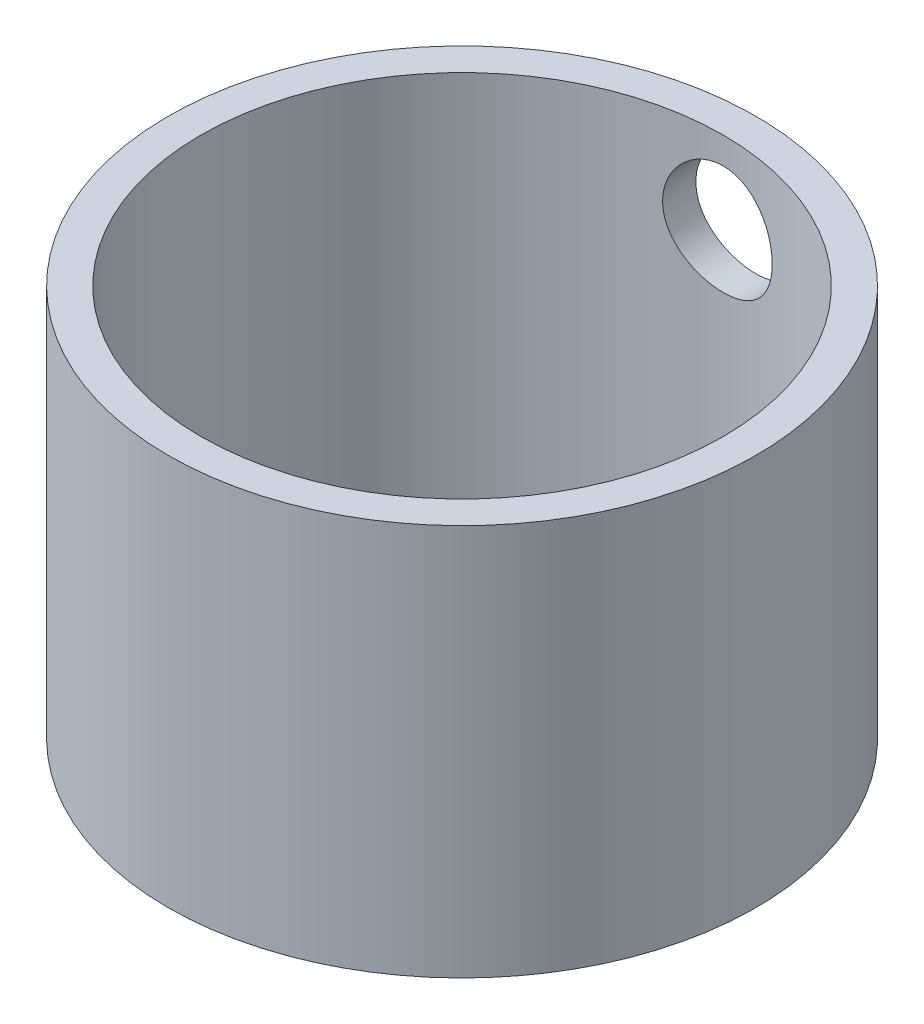
ISO-10303-21;
HEADER;
FILE_DESCRIPTION(('STEP AP214'),'2;1');
FILE_NAME('part.step','',(''),(''),'','','');
FILE_SCHEMA(('AUTOMOTIVE_DESIGN { 1 0 10303 214 1 1 1 1 }'));
ENDSEC;
DATA;
#1=APPLICATION_CONTEXT('core data for automotive mechanical design processes');
#2=APPLICATION_PROTOCOL_DEFINITION('international standard','automotive_design',2000,#1);
#3=PRODUCT_CONTEXT('',#1,'mechanical');
#4=PRODUCT('Part','Part','',(#3));
#5=PRODUCT_RELATED_PRODUCT_CATEGORY('part','',(#4));
#6=PRODUCT_DEFINITION_FORMATION('','',#4);
#7=PRODUCT_DEFINITION_CONTEXT('part definition',#1,'design');
#8=PRODUCT_DEFINITION('design','',#6,#7);
#9=PRODUCT_DEFINITION_SHAPE('','',#8);
#10=(LENGTH_UNIT() NAMED_UNIT(*) SI_UNIT(.MILLI.,.METRE.));
#11=(NAMED_UNIT(*) PLANE_ANGLE_UNIT() SI_UNIT($,.RADIAN.));
#12=(NAMED_UNIT(*) SI_UNIT($,.STERADIAN.) SOLID_ANGLE_UNIT());
#13=UNCERTAINTY_MEASURE_WITH_UNIT(LENGTH_MEASURE(1.E-05),#10,'distance_accuracy_value','');
#14=(GEOMETRIC_REPRESENTATION_CONTEXT(3) GLOBAL_UNCERTAINTY_ASSIGNED_CONTEXT((#13)) GLOBAL_UNIT_ASSIGNED_CONTEXT((#10,
#11,#12)) REPRESENTATION_CONTEXT('',''));
#15=CARTESIAN_POINT('',(0.,0.,0.));
#16=DIRECTION('',(0.,0.,1.));
#17=DIRECTION('',(1.,0.,0.));
#18=AXIS2_PLACEMENT_3D('',#15,#16,#17);
#19=CARTESIAN_POINT('',(0.,76.2,0.));
#20=DIRECTION('',(0.,1.,0.));
#21=DIRECTION('',(0.,0.,1.));
#22=AXIS2_PLACEMENT_3D('',#19,#20,#21);
#23=PLANE('',#22);
#24=CARTESIAN_POINT('',(0.,76.2,0.));
#25=DIRECTION('',(0.,1.,0.));
#26=DIRECTION('',(0.,0.,1.));
#27=AXIS2_PLACEMENT_3D('',#24,#25,#26);
#28=CIRCLE('',#27,57.15);
#29=CARTESIAN_POINT('',(0.,76.2,57.15));
#30=VERTEX_POINT('',#29);
#31=EDGE_CURVE('E10',#30,#30,#28,.T.);
#32=ORIENTED_EDGE('',*,*,#31,.T.);
#33=EDGE_LOOP('',(#32));
#34=FACE_BOUND('',#33,.T.);
#35=CARTESIAN_POINT('',(0.,76.2,0.));
#36=DIRECTION('',(0.,1.,0.));
#37=DIRECTION('',(0.,0.,1.));
#38=AXIS2_PLACEMENT_3D('',#35,#36,#37);
#39=CIRCLE('',#38,50.8);
#40=CARTESIAN_POINT('',(0.,76.2,50.8));
#41=VERTEX_POINT('',#40);
#42=EDGE_CURVE('E48',#41,#41,#39,.T.);
#43=ORIENTED_EDGE('',*,*,#42,.F.);
#44=EDGE_LOOP('',(#43));
#45=FACE_BOUND('',#44,.T.);
#46=ADVANCED_FACE('F37',(#34,#45),#23,.T.);
#47=CARTESIAN_POINT('',(0.,0.,0.));
#48=DIRECTION('',(0.,1.,0.));
#49=DIRECTION('',(0.,0.,1.));
#50=AXIS2_PLACEMENT_3D('',#47,#48,#49);
#51=PLANE('',#50);
#52=CARTESIAN_POINT('',(0.,0.,0.));
#53=DIRECTION('',(0.,1.,0.));
#54=DIRECTION('',(0.,0.,1.));
#55=AXIS2_PLACEMENT_3D('',#52,#53,#54);
#56=CIRCLE('',#55,57.15);
#57=CARTESIAN_POINT('',(0.,0.,57.15));
#58=VERTEX_POINT('',#57);
#59=EDGE_CURVE('E41',#58,#58,#56,.T.);
#60=ORIENTED_EDGE('',*,*,#59,.F.);
#61=EDGE_LOOP('',(#60));
#62=FACE_BOUND('',#61,.T.);
#63=CARTESIAN_POINT('',(0.,0.,0.));
#64=DIRECTION('',(0.,1.,0.));
#65=DIRECTION('',(0.,0.,1.));
#66=AXIS2_PLACEMENT_3D('',#63,#64,#65);
#67=CIRCLE('',#66,50.8);
#68=CARTESIAN_POINT('',(0.,0.,50.8));
#69=VERTEX_POINT('',#68);
#70=EDGE_CURVE('E50',#69,#69,#67,.T.);
#71=ORIENTED_EDGE('',*,*,#70,.T.);
#72=EDGE_LOOP('',(#71));
#73=FACE_BOUND('',#72,.T.);
#74=ADVANCED_FACE('F81',(#62,#73),#51,.F.);
#75=CARTESIAN_POINT('',(0.,76.2,0.));
#76=DIRECTION('',(0.,-1.,0.));
#77=DIRECTION('',(0.,0.,-1.));
#78=AXIS2_PLACEMENT_3D('',#75,#76,#77);
#79=CYLINDRICAL_SURFACE('',#78,57.15);
#80=CARTESIAN_POINT('',(10.668,60.325,-56.1454920363158));
#81=CARTESIAN_POINT('',(10.6680053435055,60.0281002142376,-56.1454893128091));
#82=CARTESIAN_POINT('',(10.6556020219108,59.7312693918652,-56.1478515293687));
#83=CARTESIAN_POINT('',(10.606095905013,59.1396585889627,-56.1572249422256));
#84=CARTESIAN_POINT('',(10.5689886300752,58.8448789901844,-56.164236981687));
#85=CARTESIAN_POINT('',(10.4703208308121,58.2593695400203,-56.1827142781587));
#86=CARTESIAN_POINT('',(10.4087422146498,57.9686428499494,-56.1941828297608));
#87=CARTESIAN_POINT('',(10.2616122363095,57.3935085448499,-56.2212362500718));
#88=CARTESIAN_POINT('',(10.1760602951187,57.1091010826249,-56.2368212182015));
#89=CARTESIAN_POINT('',(9.98173011068625,56.5488761749935,-56.2716384014403));
#90=CARTESIAN_POINT('',(9.87297423932011,56.273050746732,-56.2908671014924));
#91=CARTESIAN_POINT('',(9.63299352385481,55.73159688208,-56.3324307618894));
#92=CARTESIAN_POINT('',(9.5017684559971,55.4659685472691,-56.3547657531676));
#93=CARTESIAN_POINT('',(9.21781176024307,54.9467362763359,-56.4019072936164));
#94=CARTESIAN_POINT('',(9.06508238378619,54.6931310851357,-56.4267135839697));
#95=CARTESIAN_POINT('',(8.73917781947796,54.199606707423,-56.4781061476302));
#96=CARTESIAN_POINT('',(8.56600236846665,53.9596876971232,-56.5046924438458));
#97=CARTESIAN_POINT('',(8.19837053410756,53.4925584092556,-56.5592089796012));
#98=CARTESIAN_POINT('',(8.00370003086592,53.2655179721948,-56.5871508282602));
#99=CARTESIAN_POINT('',(7.59601086580315,52.8285926375836,-56.6433177742366));
#100=CARTESIAN_POINT('',(7.38299206630169,52.6187078687876,-56.6715428736781));
#101=CARTESIAN_POINT('',(6.94003755155489,52.2175095803362,-56.7274907321899));
#102=CARTESIAN_POINT('',(6.7101005311614,52.0261974961079,-56.7552134522984));
#103=CARTESIAN_POINT('',(6.23488729965975,51.6634904177321,-56.8093817790818));
#104=CARTESIAN_POINT('',(5.98961146574776,51.4920949341121,-56.8358274171331));
#105=CARTESIAN_POINT('',(5.4834662250539,51.1692033504364,-56.8868989474121));
#106=CARTESIAN_POINT('',(5.22249266591591,51.0178680221405,-56.9115095179408));
#107=CARTESIAN_POINT('',(4.68847203991897,50.7377498868863,-56.957989377066));
#108=CARTESIAN_POINT('',(4.41542489313855,50.6089672292442,-56.9798586475127));
#109=CARTESIAN_POINT('',(3.85920238113102,50.374934035286,-57.0202314557637));
#110=CARTESIAN_POINT('',(3.57602765563367,50.2696820156424,-57.0387352057104));
#111=CARTESIAN_POINT('',(3.00156615102237,50.0835163714256,-57.0718482636382));
#112=CARTESIAN_POINT('',(2.71027947477779,50.0026024383694,-57.0864576209801));
#113=CARTESIAN_POINT('',(2.12510665673257,49.8665422124005,-57.1112177166413));
#114=CARTESIAN_POINT('',(1.83128911202005,49.8111098285821,-57.1214178769915));
#115=CARTESIAN_POINT('',(1.23991841352963,49.7250894634677,-57.1373134494815));
#116=CARTESIAN_POINT('',(0.94236528558942,49.6945013104289,-57.1430088927613));
#117=CARTESIAN_POINT('',(0.345710954915687,49.6584154245063,-57.1497330447847));
#118=CARTESIAN_POINT('',(0.0466098685799811,49.6529158317761,-57.1507620994534));
#119=CARTESIAN_POINT('',(-0.550976149248027,49.6670464126327,-57.1481250983446));
#120=CARTESIAN_POINT('',(-0.849461084890794,49.6866764163866,-57.1444590742979));
#121=CARTESIAN_POINT('',(-1.43994039745177,49.7505078680778,-57.1326106040949));
#122=CARTESIAN_POINT('',(-1.73196933132848,49.7944007711553,-57.1244848798254));
#123=CARTESIAN_POINT('',(-2.31123832041491,49.9061990492478,-57.1039812391106));
#124=CARTESIAN_POINT('',(-2.5984784218681,49.9741041922474,-57.0916033637512));
#125=CARTESIAN_POINT('',(-3.16617206399007,50.1334105448513,-57.0629357699026));
#126=CARTESIAN_POINT('',(-3.44662544224986,50.2248123161322,-57.0466459579009));
#127=CARTESIAN_POINT('',(-3.99881031490527,50.4304288109504,-57.0106005737705));
#128=CARTESIAN_POINT('',(-4.27054173456425,50.5446437299083,-56.9908449719536));
#129=CARTESIAN_POINT('',(-4.8049291915128,50.7957543534805,-56.9482871547747));
#130=CARTESIAN_POINT('',(-5.06752605662121,50.9327731858043,-56.9254685379024));
#131=CARTESIAN_POINT('',(-5.58026384966287,51.2280552234607,-56.8774952640658));
#132=CARTESIAN_POINT('',(-5.83040475000099,51.3863184758556,-56.8523406019266));
#133=CARTESIAN_POINT('',(-6.31658031631716,51.7229959674325,-56.8003793562522));
#134=CARTESIAN_POINT('',(-6.55261393721327,51.9014116967086,-56.7735726506298));
#135=CARTESIAN_POINT('',(-7.00899689455062,52.2771704029406,-56.7190381734023));
#136=CARTESIAN_POINT('',(-7.22934572471225,52.4745139903749,-56.691310372108));
#137=CARTESIAN_POINT('',(-7.65611372145628,52.889936847343,-56.6352668634976));
#138=CARTESIAN_POINT('',(-7.86227017639148,53.1082857559613,-56.6069486271238));
#139=CARTESIAN_POINT('',(-8.25548697805042,53.5616283962884,-56.5509406440695));
#140=CARTESIAN_POINT('',(-8.44254712130291,53.7966223053044,-56.5232509040881));
#141=CARTESIAN_POINT('',(-8.79626888407681,54.2816586900094,-56.469285234151));
#142=CARTESIAN_POINT('',(-8.96292982115609,54.5317016687379,-56.4430093515116));
#143=CARTESIAN_POINT('',(-9.27465069238803,55.0451075981382,-56.3926262297478));
#144=CARTESIAN_POINT('',(-9.41971129743046,55.3084701347742,-56.3685189232784));
#145=CARTESIAN_POINT('',(-9.68740276471404,55.8471584551608,-56.323132019947));
#146=CARTESIAN_POINT('',(-9.80999500364834,56.1225038508072,-56.3018573091935));
#147=CARTESIAN_POINT('',(-10.0315173846072,56.6827984401222,-56.2628102652673));
#148=CARTESIAN_POINT('',(-10.1304474591817,56.9677476611643,-56.2450379420783));
#149=CARTESIAN_POINT('',(-10.3038678152634,57.5451801325214,-56.2135266906923));
#150=CARTESIAN_POINT('',(-10.3783603428246,57.8376626877817,-56.1997873918322));
#151=CARTESIAN_POINT('',(-10.5023235857421,58.4280546256904,-56.1767539265343));
#152=CARTESIAN_POINT('',(-10.5517946481744,58.7259639330043,-56.1674596984384));
#153=CARTESIAN_POINT('',(-10.6247650455299,59.3205315410175,-56.1537017977373));
#154=CARTESIAN_POINT('',(-10.6486415425639,59.6171419790165,-56.1491679964493));
#155=CARTESIAN_POINT('',(-10.6715373301968,60.2113540139756,-56.1448210360734));
#156=CARTESIAN_POINT('',(-10.6705568670674,60.5089556010866,-56.1450078302158));
#157=CARTESIAN_POINT('',(-10.6437475281067,61.1029821047678,-56.1500963736186));
#158=CARTESIAN_POINT('',(-10.6179197984644,61.3994070749814,-56.154997905391));
#159=CARTESIAN_POINT('',(-10.5416233775702,61.9889553154861,-56.1693704773642));
#160=CARTESIAN_POINT('',(-10.4911547289198,62.2820785914846,-56.1788415096648));
#161=CARTESIAN_POINT('',(-10.3664878605068,62.8605428593687,-56.2019786778698));
#162=CARTESIAN_POINT('',(-10.2924875761907,63.1459279514618,-56.2156097842757));
#163=CARTESIAN_POINT('',(-10.1212026124785,63.7094043427048,-56.246700581834));
#164=CARTESIAN_POINT('',(-10.0239180996944,63.9874956940298,-56.2641602455908));
#165=CARTESIAN_POINT('',(-9.80678092253286,64.5344972106103,-56.3024128422035));
#166=CARTESIAN_POINT('',(-9.68692728128441,64.8034069778592,-56.3232059193355));
#167=CARTESIAN_POINT('',(-9.42551533077492,65.3302333253695,-56.3675414267328));
#168=CARTESIAN_POINT('',(-9.28395621660532,65.5881494974998,-56.3910839589491));
#169=CARTESIAN_POINT('',(-8.97839124442529,66.094147293291,-56.4405457734426));
#170=CARTESIAN_POINT('',(-8.8141472786049,66.3420827835569,-56.4664891496591));
#171=CARTESIAN_POINT('',(-8.46562351787587,66.8232844592019,-56.5197910848102));
#172=CARTESIAN_POINT('',(-8.28134359257236,67.0565505490964,-56.5471496529543));
#173=CARTESIAN_POINT('',(-7.89399291297515,67.5068740808414,-56.6025232987714));
#174=CARTESIAN_POINT('',(-7.69092046597822,67.7239300594067,-56.6305384354137));
#175=CARTESIAN_POINT('',(-7.26737391436169,68.1403502466439,-56.6864480636977));
#176=CARTESIAN_POINT('',(-7.04690009962031,68.3397147499093,-56.7143425573411));
#177=CARTESIAN_POINT('',(-6.58698853513211,68.7219272201504,-56.7696082446884));
#178=CARTESIAN_POINT('',(-6.34733798004234,68.9045209429374,-56.7969675843192));
#179=CARTESIAN_POINT('',(-5.85332583451095,69.2488701137769,-56.8500024698119));
#180=CARTESIAN_POINT('',(-5.59896409645104,69.4106253526746,-56.8756779987722));
#181=CARTESIAN_POINT('',(-5.07729650085051,69.7121209417771,-56.9246183969944));
#182=CARTESIAN_POINT('',(-4.80999097206084,69.8518618507265,-56.9478833274346));
#183=CARTESIAN_POINT('',(-4.26430253630616,70.1082933357046,-56.9913425665682));
#184=CARTESIAN_POINT('',(-3.98591972854895,70.2249841181139,-57.011536902754));
#185=CARTESIAN_POINT('',(-3.42153063954877,70.43387835645,-57.0481828992564));
#186=CARTESIAN_POINT('',(-3.13557170777546,70.5262063890717,-57.0646535358305));
#187=CARTESIAN_POINT('',(-2.55669111083468,70.6864549173808,-57.0935180683261));
#188=CARTESIAN_POINT('',(-2.26376945946885,70.754375461445,-57.1059119723278));
#189=CARTESIAN_POINT('',(-1.67311412298725,70.8652655383268,-57.1262680282703));
#190=CARTESIAN_POINT('',(-1.37538086032568,70.9082372495228,-57.1342305671282));
#191=CARTESIAN_POINT('',(-0.777262955517664,70.9688921042587,-57.1454969640587));
#192=CARTESIAN_POINT('',(-0.476878343879288,70.9865755384004,-57.1488008756662));
#193=CARTESIAN_POINT('',(0.119756129154167,70.9964359808056,-57.1506413117886));
#194=CARTESIAN_POINT('',(0.41599950580166,70.9889962615494,-57.1492494737742));
#195=CARTESIAN_POINT('',(1.0067821900631,70.9495120996756,-57.1418949436562));
#196=CARTESIAN_POINT('',(1.30132151609208,70.9174679234516,-57.1359323010409));
#197=CARTESIAN_POINT('',(1.88659106569367,70.8290272681934,-57.1196024155989));
#198=CARTESIAN_POINT('',(2.17732134283925,70.772631132041,-57.1092352347892));
#199=CARTESIAN_POINT('',(2.75292297534597,70.6359234169398,-57.0843840745364));
#200=CARTESIAN_POINT('',(3.03779430994561,70.5556117532605,-57.0699000805078));
#201=CARTESIAN_POINT('',(3.59919612374446,70.3718450460076,-57.0372441226281));
#202=CARTESIAN_POINT('',(3.87574035327473,70.2684308330535,-57.0190786704483));
#203=CARTESIAN_POINT('',(4.41911501173276,70.0391445635615,-56.9795413846814));
#204=CARTESIAN_POINT('',(4.68594546786122,69.9132725699163,-56.9581695600737));
#205=CARTESIAN_POINT('',(5.20805056334296,69.6400006529202,-56.9128049797255));
#206=CARTESIAN_POINT('',(5.46332717504993,69.4926044222619,-56.8888126737318));
#207=CARTESIAN_POINT('',(5.96078813016199,69.177231468022,-56.8388426679564));
#208=CARTESIAN_POINT('',(6.20296651763529,69.0092454935468,-56.8128640777313));
#209=CARTESIAN_POINT('',(6.6758468736523,68.6513711633385,-56.7592547592977));
#210=CARTESIAN_POINT('',(6.90633717839445,68.461205791762,-56.73160581574));
#211=CARTESIAN_POINT('',(7.35043244233507,68.0623387397904,-56.6757771889852));
#212=CARTESIAN_POINT('',(7.56404434257864,67.8536447548425,-56.6475977299221));
#213=CARTESIAN_POINT('',(7.97313432236454,67.4189738598418,-56.5914683169194));
#214=CARTESIAN_POINT('',(8.168604232459,67.1929892464768,-56.5635184714901));
#215=CARTESIAN_POINT('',(8.53995872375113,66.7253497580238,-56.50864399098));
#216=CARTESIAN_POINT('',(8.7158434691695,66.4836950143559,-56.4817193473041));
#217=CARTESIAN_POINT('',(9.04832424384853,65.9840564183997,-56.4294153918447));
#218=CARTESIAN_POINT('',(9.20472799464828,65.7259428260576,-56.4040525701628));
#219=CARTESIAN_POINT('',(9.49519485663734,65.1972154690247,-56.3558821822724));
#220=CARTESIAN_POINT('',(9.62925833408055,64.9266019093556,-56.3330745741751));
#221=CARTESIAN_POINT('',(9.87394395637644,64.3749873384021,-56.2907022244708));
#222=CARTESIAN_POINT('',(9.98458535612375,64.0939950842375,-56.2711348220505));
#223=CARTESIAN_POINT('',(10.1816889037324,63.5235208620071,-56.2358044417008));
#224=CARTESIAN_POINT('',(10.2681559503713,63.2340406271319,-56.2200406930743));
#225=CARTESIAN_POINT('',(10.4501537600048,62.514539708433,-56.1865560143568));
#226=CARTESIAN_POINT('',(10.5317404811743,62.080798657161,-56.1712378077497));
#227=CARTESIAN_POINT('',(10.6406589096588,61.2063209904721,-56.1507079748847));
#228=CARTESIAN_POINT('',(10.6679920705028,60.7655845627901,-56.1454960778647));
#229=CARTESIAN_POINT('',(10.668,60.325,-56.1454920363158));
#230=B_SPLINE_CURVE_WITH_KNOTS('',3,(#80,#81,#82,#83,#84,#85,#86,#87,#88,#89,#90,#91,#92,#93,
#94,#95,#96,#97,#98,#99,#100,#101,#102,#103,#104,#105,#106,#107,#108,#109,#110,#111,#112,#113,
#114,#115,#116,#117,#118,#119,#120,#121,#122,#123,#124,#125,#126,#127,#128,#129,#130,#131,#132,
#133,#134,#135,#136,#137,#138,#139,#140,#141,#142,#143,#144,#145,#146,#147,#148,#149,#150,#151,
#152,#153,#154,#155,#156,#157,#158,#159,#160,#161,#162,#163,#164,#165,#166,#167,#168,#169,#170,
#171,#172,#173,#174,#175,#176,#177,#178,#179,#180,#181,#182,#183,#184,#185,#186,#187,#188,#189,
#190,#191,#192,#193,#194,#195,#196,#197,#198,#199,#200,#201,#202,#203,#204,#205,#206,#207,#208,
#209,#210,#211,#212,#213,#214,#215,#216,#217,#218,#219,#220,#221,#222,#223,#224,#225,#226,#227,
#228,#229),.UNSPECIFIED.,.T.,.F.,(4,2,2,2,2,2,2,2,2,2,2,2,2,2,2,2,2,2,2,2,2,2,2,2,2,2,2,2,2,2,2,
2,2,2,2,2,2,2,2,2,2,2,2,2,2,2,2,2,2,2,2,2,2,2,2,2,2,2,2,2,2,2,2,2,2,2,2,2,2,2,2,2,2,2,4),(0.,
0.890312454185734,1.78078639512363,2.67191989819081,3.563074926104,4.45337460593572,
5.34368315229553,6.23389855512009,7.12412541709212,8.02419493488521,8.92427120712908,
9.82441698828102,10.7245406426804,11.6314907017013,12.5384467652045,13.4453456397615,
14.352233018975,15.2486735938774,16.1451079718327,17.0414758949082,17.9378377601105,
18.8230546682671,19.7082630233511,20.5934925409182,21.4787296418073,22.3689115420773,
23.2590954143823,24.1493451509057,25.0396236102297,25.9434373820955,26.8472607830942,
27.7511144126553,28.6549399633565,29.5603049162017,30.4656724497953,31.3709567477619,
32.2762284880682,33.1679685710232,34.0596998190139,34.9513899339659,35.8430785072857,
36.7274567066504,37.6118285779752,38.49623873682,39.3806817003661,40.275235481587,
41.1697950849503,42.0644353427647,42.9590607004847,43.8655562220353,44.7720608413272,
45.6785424489599,46.5850159399957,47.4867602693851,48.3885028114661,49.2901666070953,
50.1918200411142,51.079780606604,51.9677315582427,52.8556700077175,53.7436116031097,
54.6299961260623,55.5163781667518,56.4026083182353,57.2892381192904,58.188451580305,
59.0872933046464,59.9865378387581,60.8857748321777,61.7932822264314,62.700774741242,
63.6075182995035,64.5140779786014,65.8352929196327,67.1564724629817),.UNSPECIFIED.);
#231=CARTESIAN_POINT('',(10.668,60.325,-56.1454920363158));
#232=VERTEX_POINT('',#231);
#233=EDGE_CURVE('E53',#232,#232,#230,.T.);
#234=ORIENTED_EDGE('',*,*,#233,.F.);
#235=EDGE_LOOP('',(#234));
#236=FACE_BOUND('',#235,.T.);
#237=ORIENTED_EDGE('',*,*,#31,.F.);
#238=EDGE_LOOP('',(#237));
#239=FACE_BOUND('',#238,.T.);
#240=ORIENTED_EDGE('',*,*,#59,.T.);
#241=EDGE_LOOP('',(#240));
#242=FACE_BOUND('',#241,.T.);
#243=ADVANCED_FACE('F39',(#236,#239,#242),#79,.T.);
#244=CARTESIAN_POINT('',(0.,76.2,0.));
#245=DIRECTION('',(0.,-1.,0.));
#246=DIRECTION('',(0.,0.,-1.));
#247=AXIS2_PLACEMENT_3D('',#244,#245,#246);
#248=CYLINDRICAL_SURFACE('',#247,50.8);
#249=CARTESIAN_POINT('',(10.668,60.325,-49.6672304039595));
#250=CARTESIAN_POINT('',(10.6680064179047,60.028854375703,-49.667226740784));
#251=CARTESIAN_POINT('',(10.6556654198348,59.7327868228675,-49.6698839389555));
#252=CARTESIAN_POINT('',(10.6064141684913,59.142708298683,-49.6804254294954));
#253=CARTESIAN_POINT('',(10.5695000027589,58.8486976623633,-49.6883105542363));
#254=CARTESIAN_POINT('',(10.4713587486947,58.2647561314229,-49.7090851006482));
#255=CARTESIAN_POINT('',(10.4101156628788,57.9748280514334,-49.7219778149356));
#256=CARTESIAN_POINT('',(10.2638062684702,57.4012883722729,-49.7523854753135));
#257=CARTESIAN_POINT('',(10.1787394575117,57.1176769064352,-49.7699005188734));
#258=CARTESIAN_POINT('',(9.98554819401652,56.5590598976307,-49.8090204611268));
#259=CARTESIAN_POINT('',(9.87744879179409,56.2840453742759,-49.8306209136732));
#260=CARTESIAN_POINT('',(9.63894802482675,55.7441710923583,-49.8773038230206));
#261=CARTESIAN_POINT('',(9.50854647276257,55.4793114191105,-49.9023863090674));
#262=CARTESIAN_POINT('',(9.22641816266586,54.9615751956239,-49.9553179513698));
#263=CARTESIAN_POINT('',(9.0746961822373,54.708695977665,-49.9831664873843));
#264=CARTESIAN_POINT('',(8.75091416695954,54.216436786861,-50.040868702567));
#265=CARTESIAN_POINT('',(8.5788474351009,53.9770612976384,-50.0707230405934));
#266=CARTESIAN_POINT('',(8.21306950112784,53.5102475583186,-50.1320290761357));
#267=CARTESIAN_POINT('',(8.01909186897736,53.2830201831565,-50.1634971548366));
#268=CARTESIAN_POINT('',(7.61279515799434,52.8456505396726,-50.2267618745447));
#269=CARTESIAN_POINT('',(7.40047594163277,52.6355083994824,-50.258558518014));
#270=CARTESIAN_POINT('',(6.95886667936273,52.2336749075259,-50.3216049320053));
#271=CARTESIAN_POINT('',(6.72957240954979,52.0419881755028,-50.3528545640065));
#272=CARTESIAN_POINT('',(6.25567585389706,51.6785043435488,-50.4139223396688));
#273=CARTESIAN_POINT('',(6.01107896256648,51.5067002947258,-50.4437409813079));
#274=CARTESIAN_POINT('',(5.50566138255326,51.1825203114018,-50.5014158998829));
#275=CARTESIAN_POINT('',(5.24470452836865,51.0303525977462,-50.5292499337622));
#276=CARTESIAN_POINT('',(4.710578956248,50.7485788914114,-50.5818391254559));
#277=CARTESIAN_POINT('',(4.43741013521844,50.6189730892453,-50.6065942572716));
#278=CARTESIAN_POINT('',(3.88080707872773,50.3833258140933,-50.6523177577627));
#279=CARTESIAN_POINT('',(3.59737366500391,50.2772824596318,-50.6732864287642));
#280=CARTESIAN_POINT('',(3.02225951084369,50.0895877863744,-50.7108368678245));
#281=CARTESIAN_POINT('',(2.7305789037396,50.0079360734856,-50.7274187067603));
#282=CARTESIAN_POINT('',(2.14537772134889,49.8706903039013,-50.7555112138966));
#283=CARTESIAN_POINT('',(1.85194497342359,49.8147359881935,-50.7670918483486));
#284=CARTESIAN_POINT('',(1.26126755177389,49.7276160193606,-50.7851996460984));
#285=CARTESIAN_POINT('',(0.964022911256739,49.6964501504402,-50.7917268533885));
#286=CARTESIAN_POINT('',(0.367925733568583,49.6591654065131,-50.7995420274176));
#287=CARTESIAN_POINT('',(0.0690733478801687,49.6530442117812,-50.8008304793882));
#288=CARTESIAN_POINT('',(-0.528066156802919,49.6658934236438,-50.7981327318641));
#289=CARTESIAN_POINT('',(-0.826353280648357,49.6848636139325,-50.7941465778403));
#290=CARTESIAN_POINT('',(-1.41550014307286,49.7472427316987,-50.7811167232563));
#291=CARTESIAN_POINT('',(-1.70640293212151,49.7902628483913,-50.7721535011907));
#292=CARTESIAN_POINT('',(-2.2834836173013,49.900116417379,-50.749473777546));
#293=CARTESIAN_POINT('',(-2.56966157117637,49.9669495784205,-50.7357573341028));
#294=CARTESIAN_POINT('',(-3.13531167617286,50.1239119121977,-50.7039453482668));
#295=CARTESIAN_POINT('',(-3.41478364128608,50.2140417303129,-50.6858496845587));
#296=CARTESIAN_POINT('',(-3.96510716321798,50.4169146433385,-50.6457703148966));
#297=CARTESIAN_POINT('',(-4.23595862897604,50.5296579770297,-50.6237865678876));
#298=CARTESIAN_POINT('',(-4.76904036944461,50.7777751548351,-50.5763616358681));
#299=CARTESIAN_POINT('',(-5.03119913913505,50.9132982843499,-50.5508978653119));
#300=CARTESIAN_POINT('',(-5.54319063057661,51.205453052966,-50.4973197389519));
#301=CARTESIAN_POINT('',(-5.79302331996511,51.3620847474846,-50.4692053761892));
#302=CARTESIAN_POINT('',(-6.27870880100591,51.6953549044514,-50.4110864734795));
#303=CARTESIAN_POINT('',(-6.51456247694085,51.8719920993323,-50.3810820533416));
#304=CARTESIAN_POINT('',(-6.97085302087951,52.2441497646041,-50.3199783624741));
#305=CARTESIAN_POINT('',(-7.19128443418998,52.4396768585215,-50.2888787101608));
#306=CARTESIAN_POINT('',(-7.61924848034008,52.852164328407,-50.2258372860953));
#307=CARTESIAN_POINT('',(-7.8264554167672,53.0694620376884,-50.1938907577801));
#308=CARTESIAN_POINT('',(-8.22186506227871,53.5207973600869,-50.1306396912259));
#309=CARTESIAN_POINT('',(-8.410067707986,53.7548350290254,-50.0993351551281));
#310=CARTESIAN_POINT('',(-8.76620154569415,54.2381246167472,-50.0382490713183));
#311=CARTESIAN_POINT('',(-8.93412840694476,54.4873797688095,-50.0084678497547));
#312=CARTESIAN_POINT('',(-9.24840896759611,54.9992770654574,-49.9513007305468));
#313=CARTESIAN_POINT('',(-9.39477045404666,55.2619143315597,-49.9239139697454));
#314=CARTESIAN_POINT('',(-9.66528802354256,55.7995994738017,-49.8722491380694));
#315=CARTESIAN_POINT('',(-9.78938176412943,56.0746795742766,-49.8479798473894));
#316=CARTESIAN_POINT('',(-10.0139143345431,56.634642896174,-49.8033596500329));
#317=CARTESIAN_POINT('',(-10.1143530722348,56.9195261557744,-49.7830087586183));
#318=CARTESIAN_POINT('',(-10.2907664356936,57.4970162267599,-49.7468415269371));
#319=CARTESIAN_POINT('',(-10.3667439673984,57.7896221162415,-49.7310246480641));
#320=CARTESIAN_POINT('',(-10.4936272258187,58.3804437680203,-49.7044062288866));
#321=CARTESIAN_POINT('',(-10.5445334015415,58.6786594297518,-49.6936045987632));
#322=CARTESIAN_POINT('',(-10.6201293019306,59.2728259837904,-49.6775031399171));
#323=CARTESIAN_POINT('',(-10.6452948288328,59.5687137112881,-49.6721035010555));
#324=CARTESIAN_POINT('',(-10.6708746685906,60.161604845392,-49.6666146201292));
#325=CARTESIAN_POINT('',(-10.6712892905695,60.4586082380181,-49.6665253117417));
#326=CARTESIAN_POINT('',(-10.6473650131679,61.0515514435996,-49.6716595854969));
#327=CARTESIAN_POINT('',(-10.623027570457,61.3474913181152,-49.6768828549922));
#328=CARTESIAN_POINT('',(-10.5498012001331,61.9361787165084,-49.6924852714839));
#329=CARTESIAN_POINT('',(-10.500912333639,62.2289262483313,-49.7028644056452));
#330=CARTESIAN_POINT('',(-10.379637049618,62.8059983331387,-49.7283311926287));
#331=CARTESIAN_POINT('',(-10.3075095403009,63.0903796595152,-49.7433668968832));
#332=CARTESIAN_POINT('',(-10.1401760912468,63.6519965857107,-49.7777472061836));
#333=CARTESIAN_POINT('',(-10.0449703665065,63.9292322520722,-49.7970917710881));
#334=CARTESIAN_POINT('',(-9.83220561866431,64.4746552151982,-49.8395374114402));
#335=CARTESIAN_POINT('',(-9.71464886714098,64.7428434282145,-49.8626381051107));
#336=CARTESIAN_POINT('',(-9.45798409096748,65.2685155258146,-49.9119585889289));
#337=CARTESIAN_POINT('',(-9.31886845205041,65.5259955875349,-49.9381794803199));
#338=CARTESIAN_POINT('',(-9.01798269261846,66.0320199540295,-49.9933965824946));
#339=CARTESIAN_POINT('',(-8.85592083492734,66.2803871039283,-50.0224267086724));
#340=CARTESIAN_POINT('',(-8.51179623676187,66.7626472185391,-50.0821306487748));
#341=CARTESIAN_POINT('',(-8.32973318924338,66.9965399609639,-50.1128044879288));
#342=CARTESIAN_POINT('',(-7.94679176296793,67.448373285812,-50.174955161986));
#343=CARTESIAN_POINT('',(-7.7459083458589,67.6663095685957,-50.2064322102637));
#344=CARTESIAN_POINT('',(-7.3267768546054,68.0846525483183,-50.2693069552896));
#345=CARTESIAN_POINT('',(-7.10853462174026,68.2850650947751,-50.3007046750933));
#346=CARTESIAN_POINT('',(-6.65215252552855,68.6704067241471,-50.3631095993131));
#347=CARTESIAN_POINT('',(-6.41373422467279,68.8550088210484,-50.3941007073783));
#348=CARTESIAN_POINT('',(-5.92197142491781,69.2034736552239,-50.4542526065302));
#349=CARTESIAN_POINT('',(-5.66862673435432,69.3673361261031,-50.4834133741042));
#350=CARTESIAN_POINT('',(-5.14875676613067,69.673126353248,-50.5390802315357));
#351=CARTESIAN_POINT('',(-4.88223186752865,69.8150547398466,-50.5655863976723));
#352=CARTESIAN_POINT('',(-4.33785132564814,70.0759161792875,-50.6151927350836));
#353=CARTESIAN_POINT('',(-4.05999580759308,70.194849486183,-50.6382929439872));
#354=CARTESIAN_POINT('',(-3.49665363769084,70.4081439882402,-50.6802988951499));
#355=CARTESIAN_POINT('',(-3.21122412380263,70.5026511698814,-50.6992294524481));
#356=CARTESIAN_POINT('',(-2.63315727821508,70.6672928365667,-50.7325368046173));
#357=CARTESIAN_POINT('',(-2.34051996206432,70.7374273741823,-50.7469136093107));
#358=CARTESIAN_POINT('',(-1.75020317227129,70.8527464608196,-50.7707005484069));
#359=CARTESIAN_POINT('',(-1.45252426502506,70.897933793614,-50.7801112369562));
#360=CARTESIAN_POINT('',(-0.854295595782995,70.9629944776778,-50.7936973070284));
#361=CARTESIAN_POINT('',(-0.55374587649475,70.9828682049356,-50.7978727663112));
#362=CARTESIAN_POINT('',(0.0422053211274149,70.9969994801535,-50.8008396235371));
#363=CARTESIAN_POINT('',(0.337594922232822,70.9917412555839,-50.799732798012));
#364=CARTESIAN_POINT('',(0.926854502264058,70.9567578383181,-50.7923986278664));
#365=CARTESIAN_POINT('',(1.22072450191083,70.9270329801334,-50.7861713532534));
#366=CARTESIAN_POINT('',(1.80483796585604,70.8433568778673,-50.7687693033567));
#367=CARTESIAN_POINT('',(2.09508150421154,70.789406129344,-50.7575946292758));
#368=CARTESIAN_POINT('',(2.66989668942494,70.6577061416945,-50.7306065707373));
#369=CARTESIAN_POINT('',(2.95446831341613,70.5799568066432,-50.7147931675825));
#370=CARTESIAN_POINT('',(3.51517891195639,70.4015104653976,-50.6790116990638));
#371=CARTESIAN_POINT('',(3.79133906694865,70.3008776395492,-50.6590552668483));
#372=CARTESIAN_POINT('',(4.33417222528798,70.077299220965,-50.6155025758789));
#373=CARTESIAN_POINT('',(4.60084526619367,69.9543537165749,-50.5919063315365));
#374=CARTESIAN_POINT('',(5.1229003201468,69.6870566516338,-50.5417120743475));
#375=CARTESIAN_POINT('',(5.37828364357926,69.5427075838839,-50.5151144111522));
#376=CARTESIAN_POINT('',(5.87621642889026,69.2335475211604,-50.4596162304226));
#377=CARTESIAN_POINT('',(6.11876097754643,69.0687287723144,-50.430714841736));
#378=CARTESIAN_POINT('',(6.59340385825637,68.7167836682755,-50.3708768230824));
#379=CARTESIAN_POINT('',(6.82525018238624,68.5293218702392,-50.3399137051342));
#380=CARTESIAN_POINT('',(7.27249357496624,68.1356248038038,-50.2772499448936));
#381=CARTESIAN_POINT('',(7.48788308764316,67.9293810061975,-50.2455489724429));
#382=CARTESIAN_POINT('',(7.90070768383739,67.4995286312699,-50.1822921577935));
#383=CARTESIAN_POINT('',(8.09813850636097,67.2759159561089,-50.1507363517154));
#384=CARTESIAN_POINT('',(8.47356597360509,66.8129644528119,-50.0886701241211));
#385=CARTESIAN_POINT('',(8.65157130051503,66.5736327275288,-50.0581592397979));
#386=CARTESIAN_POINT('',(8.98912737646205,66.077644707298,-49.998653397321));
#387=CARTESIAN_POINT('',(9.14841822383911,65.8208085558114,-49.969682295506));
#388=CARTESIAN_POINT('',(9.44469532266575,65.2944207610591,-49.9145313153124));
#389=CARTESIAN_POINT('',(9.58168990207514,65.0248739141543,-49.8883503960296));
#390=CARTESIAN_POINT('',(9.83234089547972,64.4750020312425,-49.8395564714499));
#391=CARTESIAN_POINT('',(9.94601077699542,64.1946833264807,-49.8169414090087));
#392=CARTESIAN_POINT('',(10.1491962831485,63.6252224743624,-49.7759431422084));
#393=CARTESIAN_POINT('',(10.2387164041248,63.3360819806706,-49.7575591501784));
#394=CARTESIAN_POINT('',(10.4324223032819,62.6009596585856,-49.71739172143));
#395=CARTESIAN_POINT('',(10.520637068307,62.150494420705,-49.6986895598014));
#396=CARTESIAN_POINT('',(10.6384197341045,61.2416235990926,-49.6736119909213));
#397=CARTESIAN_POINT('',(10.6679900697446,60.7832183458207,-49.6672360718947));
#398=CARTESIAN_POINT('',(10.668,60.325,-49.6672304039595));
#399=B_SPLINE_CURVE_WITH_KNOTS('',3,(#249,#250,#251,#252,#253,#254,#255,#256,#257,#258,#259,
#260,#261,#262,#263,#264,#265,#266,#267,#268,#269,#270,#271,#272,#273,#274,#275,#276,#277,#278,
#279,#280,#281,#282,#283,#284,#285,#286,#287,#288,#289,#290,#291,#292,#293,#294,#295,#296,#297,
#298,#299,#300,#301,#302,#303,#304,#305,#306,#307,#308,#309,#310,#311,#312,#313,#314,#315,#316,
#317,#318,#319,#320,#321,#322,#323,#324,#325,#326,#327,#328,#329,#330,#331,#332,#333,#334,#335,
#336,#337,#338,#339,#340,#341,#342,#343,#344,#345,#346,#347,#348,#349,#350,#351,#352,#353,#354,
#355,#356,#357,#358,#359,#360,#361,#362,#363,#364,#365,#366,#367,#368,#369,#370,#371,#372,#373,
#374,#375,#376,#377,#378,#379,#380,#381,#382,#383,#384,#385,#386,#387,#388,#389,#390,#391,#392,
#393,#394,#395,#396,#397,#398),.UNSPECIFIED.,.T.,.F.,(4,2,2,2,2,2,2,2,2,2,2,2,2,2,2,2,2,2,2,2,2,
2,2,2,2,2,2,2,2,2,2,2,2,2,2,2,2,2,2,2,2,2,2,2,2,2,2,2,2,2,2,2,2,2,2,2,2,2,2,2,2,2,2,2,2,2,2,2,2,
2,2,2,2,2,4),(0.,0.88803372988573,1.7762088834096,2.6649690258728,3.55374791084025,
4.44156504694617,5.32938964033388,6.21701560120807,7.10493456522804,8.00513334476561,
8.90533887476792,9.80576916081404,10.7058837947784,11.6148718593606,12.5238675990778,
13.4327907288357,14.3416991724338,15.2374441628266,16.1331813552437,17.0288355794738,
17.924482082571,18.8060509561918,19.6876090478507,20.5691915636371,21.4507833887251,
22.3383955817066,23.2260101050262,24.1135684196806,25.0014390838724,25.9062228309726,
26.8110095953216,27.7159892745116,28.6206413691548,29.5277879693885,30.4349381028566,
31.3419804290756,32.2490065103237,33.1389459663972,34.0288743076857,34.9187502793397,
35.8086240357224,36.6889077325645,37.5691832290003,38.4493693090924,39.3298669688235,
40.2227780739585,41.1157028883494,42.0088674321085,42.9017326853532,43.8100102680494,
44.7182995161468,45.6265626573389,46.5348157633304,47.4375080134123,48.3401983163886,
49.2427878708937,50.1453640188898,51.0306207615816,51.9158654011105,52.8010919331471,
53.6863220333138,54.5690993367403,55.4518731449436,56.3345442200892,57.217550674852,
58.1157720214914,59.0144033184617,59.913247277303,60.8116878397744,61.7214140376295,
62.6307996566421,63.5396587159223,64.4483484417144,65.822436758782,67.196468023661),.UNSPECIFIED.);
#400=CARTESIAN_POINT('',(10.668,60.325,-49.6672304039595));
#401=VERTEX_POINT('',#400);
#402=EDGE_CURVE('E63',#401,#401,#399,.T.);
#403=ORIENTED_EDGE('',*,*,#402,.T.);
#404=EDGE_LOOP('',(#403));
#405=FACE_BOUND('',#404,.T.);
#406=ORIENTED_EDGE('',*,*,#42,.T.);
#407=EDGE_LOOP('',(#406));
#408=FACE_BOUND('',#407,.T.);
#409=ORIENTED_EDGE('',*,*,#70,.F.);
#410=EDGE_LOOP('',(#409));
#411=FACE_BOUND('',#410,.T.);
#412=ADVANCED_FACE('F74',(#405,#408,#411),#248,.F.);
#413=CARTESIAN_POINT('',(0.,60.325,-57.151));
#414=DIRECTION('',(0.,0.,1.));
#415=DIRECTION('',(1.,0.,0.));
#416=AXIS2_PLACEMENT_3D('',#413,#414,#415);
#417=CYLINDRICAL_SURFACE('',#416,10.668);
#418=ORIENTED_EDGE('',*,*,#402,.F.);
#419=EDGE_LOOP('',(#418));
#420=FACE_BOUND('',#419,.T.);
#421=ORIENTED_EDGE('',*,*,#233,.T.);
#422=EDGE_LOOP('',(#421));
#423=FACE_BOUND('',#422,.T.);
#424=ADVANCED_FACE('F68',(#420,#423),#417,.F.);
#425=CLOSED_SHELL('',(#46,#74,#243,#412,#424));
#426=MANIFOLD_SOLID_BREP('B2',#425);
#427=ADVANCED_BREP_SHAPE_REPRESENTATION('',(#18,#426),#14);
#428=SHAPE_DEFINITION_REPRESENTATION(#9,#427);
ENDSEC;
END-ISO-10303-21;
